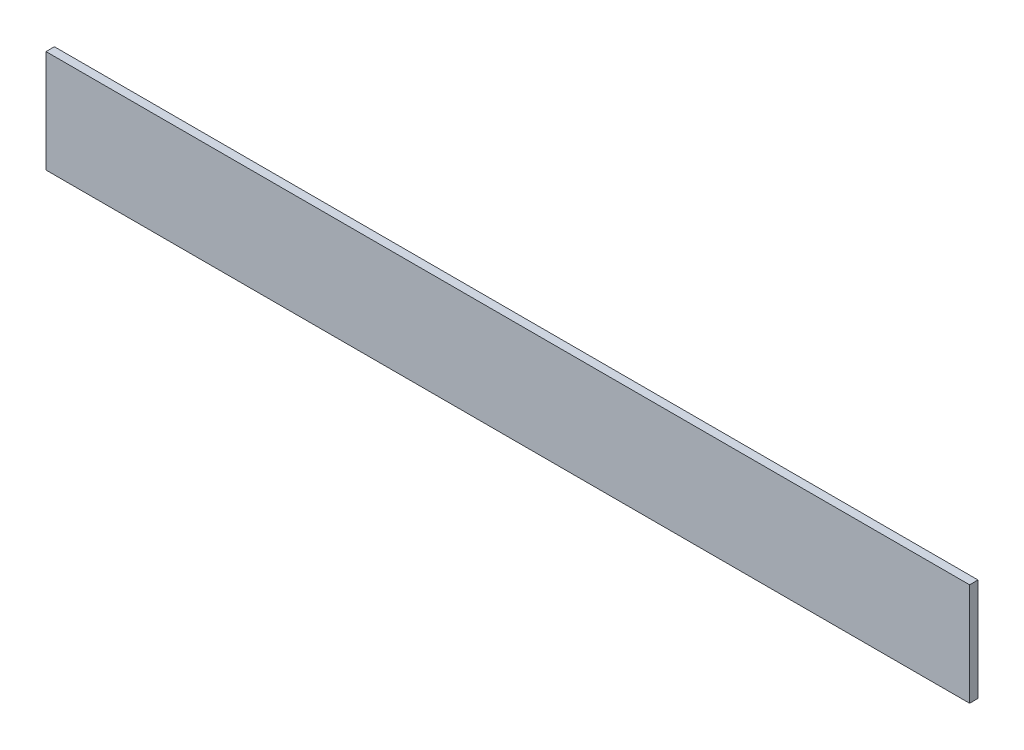
ISO-10303-21;
HEADER;
FILE_DESCRIPTION(('STEP AP214'),'2;1');
FILE_NAME('part.step','',(''),(''),'','','');
FILE_SCHEMA(('AUTOMOTIVE_DESIGN { 1 0 10303 214 1 1 1 1 }'));
ENDSEC;
DATA;
#1=APPLICATION_CONTEXT('core data for automotive mechanical design processes');
#2=APPLICATION_PROTOCOL_DEFINITION('international standard','automotive_design',2000,#1);
#3=PRODUCT_CONTEXT('',#1,'mechanical');
#4=PRODUCT('Part','Part','',(#3));
#5=PRODUCT_RELATED_PRODUCT_CATEGORY('part','',(#4));
#6=PRODUCT_DEFINITION_FORMATION('','',#4);
#7=PRODUCT_DEFINITION_CONTEXT('part definition',#1,'design');
#8=PRODUCT_DEFINITION('design','',#6,#7);
#9=PRODUCT_DEFINITION_SHAPE('','',#8);
#10=(LENGTH_UNIT() NAMED_UNIT(*) SI_UNIT(.MILLI.,.METRE.));
#11=(NAMED_UNIT(*) PLANE_ANGLE_UNIT() SI_UNIT($,.RADIAN.));
#12=(NAMED_UNIT(*) SI_UNIT($,.STERADIAN.) SOLID_ANGLE_UNIT());
#13=UNCERTAINTY_MEASURE_WITH_UNIT(LENGTH_MEASURE(1.E-05),#10,'distance_accuracy_value','');
#14=(GEOMETRIC_REPRESENTATION_CONTEXT(3) GLOBAL_UNCERTAINTY_ASSIGNED_CONTEXT((#13)) GLOBAL_UNIT_ASSIGNED_CONTEXT((#10,
#11,#12)) REPRESENTATION_CONTEXT('',''));
#15=CARTESIAN_POINT('',(0.,0.,0.));
#16=DIRECTION('',(0.,0.,1.));
#17=DIRECTION('',(1.,0.,0.));
#18=AXIS2_PLACEMENT_3D('',#15,#16,#17);
#19=CARTESIAN_POINT('',(0.,500.,0.));
#20=DIRECTION('',(1.,0.,0.));
#21=DIRECTION('',(0.,0.,-1.));
#22=AXIS2_PLACEMENT_3D('',#19,#20,#21);
#23=PLANE('',#22);
#24=DIRECTION('',(0.,0.,1.));
#25=VECTOR('',#24,1.);
#26=CARTESIAN_POINT('',(0.,0.,0.));
#27=LINE('',#26,#25);
#28=CARTESIAN_POINT('',(0.,0.,-40.9999999999999));
#29=VERTEX_POINT('',#28);
#30=CARTESIAN_POINT('',(0.,0.,0.));
#31=VERTEX_POINT('',#30);
#32=EDGE_CURVE('E113',#29,#31,#27,.T.);
#33=ORIENTED_EDGE('',*,*,#32,.T.);
#34=DIRECTION('',(0.,-1.,0.));
#35=VECTOR('',#34,1.);
#36=CARTESIAN_POINT('',(0.,500.,0.));
#37=LINE('',#36,#35);
#38=CARTESIAN_POINT('',(0.,500.,0.));
#39=VERTEX_POINT('',#38);
#40=EDGE_CURVE('E11',#39,#31,#37,.T.);
#41=ORIENTED_EDGE('',*,*,#40,.F.);
#42=DIRECTION('',(0.,0.,1.));
#43=VECTOR('',#42,1.);
#44=CARTESIAN_POINT('',(0.,500.,0.));
#45=LINE('',#44,#43);
#46=CARTESIAN_POINT('',(0.,500.,-40.9999999999999));
#47=VERTEX_POINT('',#46);
#48=EDGE_CURVE('E97',#47,#39,#45,.T.);
#49=ORIENTED_EDGE('',*,*,#48,.F.);
#50=DIRECTION('',(0.,-1.,0.));
#51=VECTOR('',#50,1.);
#52=CARTESIAN_POINT('',(0.,500.,-40.9999999999999));
#53=LINE('',#52,#51);
#54=EDGE_CURVE('E109',#47,#29,#53,.T.);
#55=ORIENTED_EDGE('',*,*,#54,.T.);
#56=EDGE_LOOP('',(#33,#41,#49,#55));
#57=FACE_BOUND('',#56,.T.);
#58=ADVANCED_FACE('F45',(#57),#23,.F.);
#59=CARTESIAN_POINT('',(0.,500.,0.));
#60=DIRECTION('',(0.,0.,-1.));
#61=DIRECTION('',(-1.,0.,0.));
#62=AXIS2_PLACEMENT_3D('',#59,#60,#61);
#63=PLANE('',#62);
#64=DIRECTION('',(1.,0.,0.));
#65=VECTOR('',#64,1.);
#66=CARTESIAN_POINT('',(0.,0.,0.));
#67=LINE('',#66,#65);
#68=CARTESIAN_POINT('',(4500.,0.,0.));
#69=VERTEX_POINT('',#68);
#70=EDGE_CURVE('E102',#31,#69,#67,.T.);
#71=ORIENTED_EDGE('',*,*,#70,.T.);
#72=DIRECTION('',(0.,-1.,0.));
#73=VECTOR('',#72,1.);
#74=CARTESIAN_POINT('',(4500.,500.,0.));
#75=LINE('',#74,#73);
#76=CARTESIAN_POINT('',(4500.,500.,0.));
#77=VERTEX_POINT('',#76);
#78=EDGE_CURVE('E54',#77,#69,#75,.T.);
#79=ORIENTED_EDGE('',*,*,#78,.F.);
#80=DIRECTION('',(1.,0.,0.));
#81=VECTOR('',#80,1.);
#82=CARTESIAN_POINT('',(0.,500.,0.));
#83=LINE('',#82,#81);
#84=EDGE_CURVE('E92',#39,#77,#83,.T.);
#85=ORIENTED_EDGE('',*,*,#84,.F.);
#86=ORIENTED_EDGE('',*,*,#40,.T.);
#87=EDGE_LOOP('',(#71,#79,#85,#86));
#88=FACE_BOUND('',#87,.T.);
#89=ADVANCED_FACE('F101',(#88),#63,.F.);
#90=CARTESIAN_POINT('',(4500.,500.,0.));
#91=DIRECTION('',(-1.,0.,0.));
#92=DIRECTION('',(0.,0.,1.));
#93=AXIS2_PLACEMENT_3D('',#90,#91,#92);
#94=PLANE('',#93);
#95=DIRECTION('',(0.,0.,-1.));
#96=VECTOR('',#95,1.);
#97=CARTESIAN_POINT('',(4500.,0.,0.));
#98=LINE('',#97,#96);
#99=CARTESIAN_POINT('',(4500.,0.,-40.9999999999999));
#100=VERTEX_POINT('',#99);
#101=EDGE_CURVE('E79',#69,#100,#98,.T.);
#102=ORIENTED_EDGE('',*,*,#101,.T.);
#103=DIRECTION('',(0.,-1.,0.));
#104=VECTOR('',#103,1.);
#105=CARTESIAN_POINT('',(4500.,500.,-40.9999999999999));
#106=LINE('',#105,#104);
#107=CARTESIAN_POINT('',(4500.,500.,-40.9999999999999));
#108=VERTEX_POINT('',#107);
#109=EDGE_CURVE('E104',#108,#100,#106,.T.);
#110=ORIENTED_EDGE('',*,*,#109,.F.);
#111=DIRECTION('',(0.,0.,-1.));
#112=VECTOR('',#111,1.);
#113=CARTESIAN_POINT('',(4500.,500.,0.));
#114=LINE('',#113,#112);
#115=EDGE_CURVE('E95',#77,#108,#114,.T.);
#116=ORIENTED_EDGE('',*,*,#115,.F.);
#117=ORIENTED_EDGE('',*,*,#78,.T.);
#118=EDGE_LOOP('',(#102,#110,#116,#117));
#119=FACE_BOUND('',#118,.T.);
#120=ADVANCED_FACE('F105',(#119),#94,.F.);
#121=CARTESIAN_POINT('',(0.,500.,-40.9999999999999));
#122=DIRECTION('',(0.,0.,1.));
#123=DIRECTION('',(1.,0.,0.));
#124=AXIS2_PLACEMENT_3D('',#121,#122,#123);
#125=PLANE('',#124);
#126=DIRECTION('',(-1.,0.,0.));
#127=VECTOR('',#126,1.);
#128=CARTESIAN_POINT('',(0.,0.,-40.9999999999999));
#129=LINE('',#128,#127);
#130=EDGE_CURVE('E85',#100,#29,#129,.T.);
#131=ORIENTED_EDGE('',*,*,#130,.T.);
#132=ORIENTED_EDGE('',*,*,#54,.F.);
#133=DIRECTION('',(-1.,0.,0.));
#134=VECTOR('',#133,1.);
#135=CARTESIAN_POINT('',(0.,500.,-40.9999999999999));
#136=LINE('',#135,#134);
#137=EDGE_CURVE('E62',#108,#47,#136,.T.);
#138=ORIENTED_EDGE('',*,*,#137,.F.);
#139=ORIENTED_EDGE('',*,*,#109,.T.);
#140=EDGE_LOOP('',(#131,#132,#138,#139));
#141=FACE_BOUND('',#140,.T.);
#142=ADVANCED_FACE('F126',(#141),#125,.F.);
#143=CARTESIAN_POINT('',(0.,500.,0.));
#144=DIRECTION('',(0.,-1.,0.));
#145=DIRECTION('',(0.,0.,-1.));
#146=AXIS2_PLACEMENT_3D('',#143,#144,#145);
#147=PLANE('',#146);
#148=ORIENTED_EDGE('',*,*,#48,.T.);
#149=ORIENTED_EDGE('',*,*,#84,.T.);
#150=ORIENTED_EDGE('',*,*,#115,.T.);
#151=ORIENTED_EDGE('',*,*,#137,.T.);
#152=EDGE_LOOP('',(#148,#149,#150,#151));
#153=FACE_BOUND('',#152,.T.);
#154=ADVANCED_FACE('F93',(#153),#147,.F.);
#155=CARTESIAN_POINT('',(0.,0.,0.));
#156=DIRECTION('',(0.,-1.,0.));
#157=DIRECTION('',(0.,0.,-1.));
#158=AXIS2_PLACEMENT_3D('',#155,#156,#157);
#159=PLANE('',#158);
#160=ORIENTED_EDGE('',*,*,#32,.F.);
#161=ORIENTED_EDGE('',*,*,#130,.F.);
#162=ORIENTED_EDGE('',*,*,#101,.F.);
#163=ORIENTED_EDGE('',*,*,#70,.F.);
#164=EDGE_LOOP('',(#160,#161,#162,#163));
#165=FACE_BOUND('',#164,.T.);
#166=ADVANCED_FACE('F129',(#165),#159,.T.);
#167=CLOSED_SHELL('',(#58,#89,#120,#142,#154,#166));
#168=MANIFOLD_SOLID_BREP('B2',#167);
#169=ADVANCED_BREP_SHAPE_REPRESENTATION('',(#18,#168),#14);
#170=SHAPE_DEFINITION_REPRESENTATION(#9,#169);
ENDSEC;
END-ISO-10303-21;
